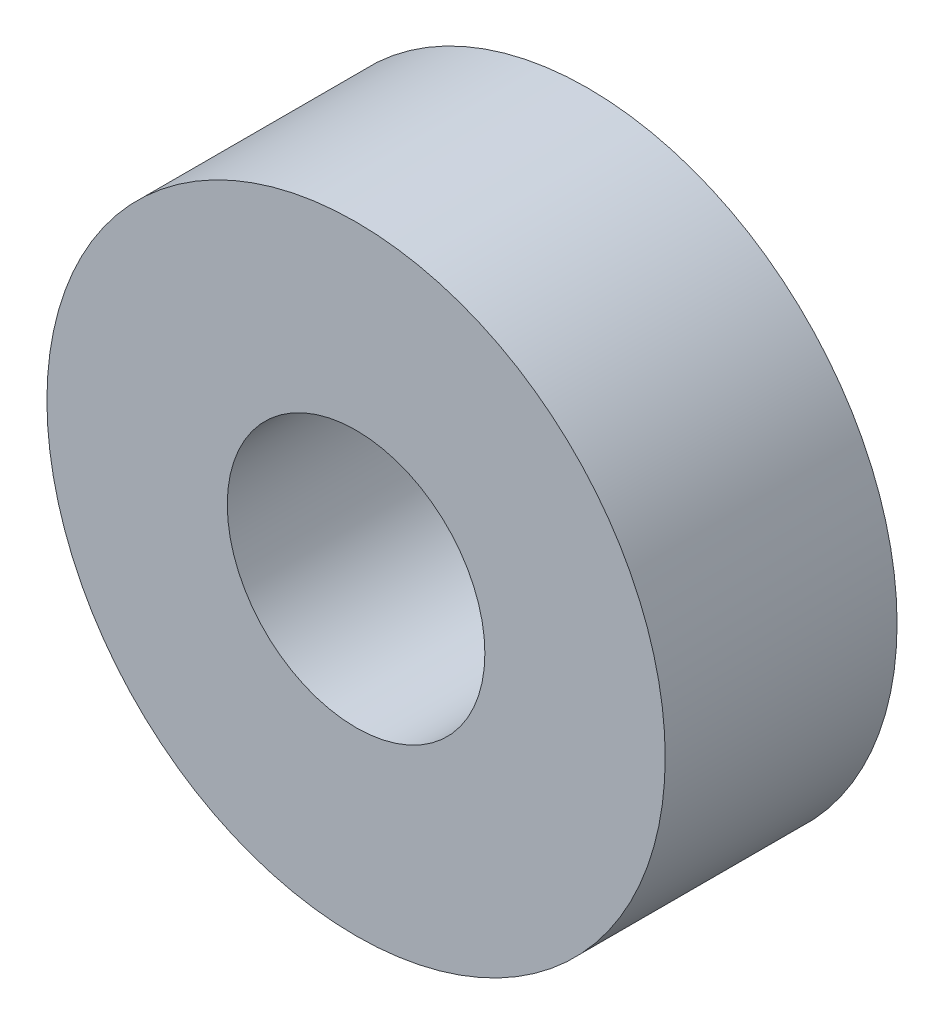
ISO-10303-21;
HEADER;
FILE_DESCRIPTION(('STEP AP214'),'2;1');
FILE_NAME('part.step','',(''),(''),'','','');
FILE_SCHEMA(('AUTOMOTIVE_DESIGN { 1 0 10303 214 1 1 1 1 }'));
ENDSEC;
DATA;
#1=APPLICATION_CONTEXT('core data for automotive mechanical design processes');
#2=APPLICATION_PROTOCOL_DEFINITION('international standard','automotive_design',2000,#1);
#3=PRODUCT_CONTEXT('',#1,'mechanical');
#4=PRODUCT('Part','Part','',(#3));
#5=PRODUCT_RELATED_PRODUCT_CATEGORY('part','',(#4));
#6=PRODUCT_DEFINITION_FORMATION('','',#4);
#7=PRODUCT_DEFINITION_CONTEXT('part definition',#1,'design');
#8=PRODUCT_DEFINITION('design','',#6,#7);
#9=PRODUCT_DEFINITION_SHAPE('','',#8);
#10=(LENGTH_UNIT() NAMED_UNIT(*) SI_UNIT(.MILLI.,.METRE.));
#11=(NAMED_UNIT(*) PLANE_ANGLE_UNIT() SI_UNIT($,.RADIAN.));
#12=(NAMED_UNIT(*) SI_UNIT($,.STERADIAN.) SOLID_ANGLE_UNIT());
#13=UNCERTAINTY_MEASURE_WITH_UNIT(LENGTH_MEASURE(1.E-05),#10,'distance_accuracy_value','');
#14=(GEOMETRIC_REPRESENTATION_CONTEXT(3) GLOBAL_UNCERTAINTY_ASSIGNED_CONTEXT((#13)) GLOBAL_UNIT_ASSIGNED_CONTEXT((#10,
#11,#12)) REPRESENTATION_CONTEXT('',''));
#15=CARTESIAN_POINT('',(0.,0.,0.));
#16=DIRECTION('',(0.,0.,1.));
#17=DIRECTION('',(1.,0.,0.));
#18=AXIS2_PLACEMENT_3D('',#15,#16,#17);
#19=CARTESIAN_POINT('',(0.,0.,9.));
#20=DIRECTION('',(0.,0.,1.));
#21=DIRECTION('',(1.,0.,0.));
#22=AXIS2_PLACEMENT_3D('',#19,#20,#21);
#23=PLANE('',#22);
#24=CARTESIAN_POINT('',(0.,0.,9.));
#25=DIRECTION('',(0.,0.,1.));
#26=DIRECTION('',(1.,0.,0.));
#27=AXIS2_PLACEMENT_3D('',#24,#25,#26);
#28=CIRCLE('',#27,12.);
#29=CARTESIAN_POINT('',(12.,0.,9.));
#30=VERTEX_POINT('',#29);
#31=EDGE_CURVE('E10',#30,#30,#28,.T.);
#32=ORIENTED_EDGE('',*,*,#31,.T.);
#33=EDGE_LOOP('',(#32));
#34=FACE_BOUND('',#33,.T.);
#35=CARTESIAN_POINT('',(0.,0.,9.));
#36=DIRECTION('',(0.,0.,1.));
#37=DIRECTION('',(1.,0.,0.));
#38=AXIS2_PLACEMENT_3D('',#35,#36,#37);
#39=CIRCLE('',#38,5.);
#40=CARTESIAN_POINT('',(5.,0.,9.));
#41=VERTEX_POINT('',#40);
#42=EDGE_CURVE('E45',#41,#41,#39,.T.);
#43=ORIENTED_EDGE('',*,*,#42,.F.);
#44=EDGE_LOOP('',(#43));
#45=FACE_BOUND('',#44,.T.);
#46=ADVANCED_FACE('F34',(#34,#45),#23,.T.);
#47=CARTESIAN_POINT('',(0.,0.,0.));
#48=DIRECTION('',(0.,0.,1.));
#49=DIRECTION('',(1.,0.,0.));
#50=AXIS2_PLACEMENT_3D('',#47,#48,#49);
#51=PLANE('',#50);
#52=CARTESIAN_POINT('',(0.,0.,0.));
#53=DIRECTION('',(0.,0.,1.));
#54=DIRECTION('',(1.,0.,0.));
#55=AXIS2_PLACEMENT_3D('',#52,#53,#54);
#56=CIRCLE('',#55,12.);
#57=CARTESIAN_POINT('',(12.,0.,0.));
#58=VERTEX_POINT('',#57);
#59=EDGE_CURVE('E38',#58,#58,#56,.T.);
#60=ORIENTED_EDGE('',*,*,#59,.F.);
#61=EDGE_LOOP('',(#60));
#62=FACE_BOUND('',#61,.T.);
#63=CARTESIAN_POINT('',(0.,0.,0.));
#64=DIRECTION('',(0.,0.,1.));
#65=DIRECTION('',(1.,0.,0.));
#66=AXIS2_PLACEMENT_3D('',#63,#64,#65);
#67=CIRCLE('',#66,5.);
#68=CARTESIAN_POINT('',(5.,0.,0.));
#69=VERTEX_POINT('',#68);
#70=EDGE_CURVE('E47',#69,#69,#67,.T.);
#71=ORIENTED_EDGE('',*,*,#70,.T.);
#72=EDGE_LOOP('',(#71));
#73=FACE_BOUND('',#72,.T.);
#74=ADVANCED_FACE('F57',(#62,#73),#51,.F.);
#75=CARTESIAN_POINT('',(0.,0.,9.));
#76=DIRECTION('',(0.,0.,-1.));
#77=DIRECTION('',(-1.,0.,0.));
#78=AXIS2_PLACEMENT_3D('',#75,#76,#77);
#79=CYLINDRICAL_SURFACE('',#78,12.);
#80=ORIENTED_EDGE('',*,*,#31,.F.);
#81=EDGE_LOOP('',(#80));
#82=FACE_BOUND('',#81,.T.);
#83=ORIENTED_EDGE('',*,*,#59,.T.);
#84=EDGE_LOOP('',(#83));
#85=FACE_BOUND('',#84,.T.);
#86=ADVANCED_FACE('F36',(#82,#85),#79,.T.);
#87=CARTESIAN_POINT('',(0.,0.,9.));
#88=DIRECTION('',(0.,0.,-1.));
#89=DIRECTION('',(-1.,0.,0.));
#90=AXIS2_PLACEMENT_3D('',#87,#88,#89);
#91=CYLINDRICAL_SURFACE('',#90,5.);
#92=ORIENTED_EDGE('',*,*,#42,.T.);
#93=EDGE_LOOP('',(#92));
#94=FACE_BOUND('',#93,.T.);
#95=ORIENTED_EDGE('',*,*,#70,.F.);
#96=EDGE_LOOP('',(#95));
#97=FACE_BOUND('',#96,.T.);
#98=ADVANCED_FACE('F53',(#94,#97),#91,.F.);
#99=CLOSED_SHELL('',(#46,#74,#86,#98));
#100=MANIFOLD_SOLID_BREP('B2',#99);
#101=ADVANCED_BREP_SHAPE_REPRESENTATION('',(#18,#100),#14);
#102=SHAPE_DEFINITION_REPRESENTATION(#9,#101);
ENDSEC;
END-ISO-10303-21;
